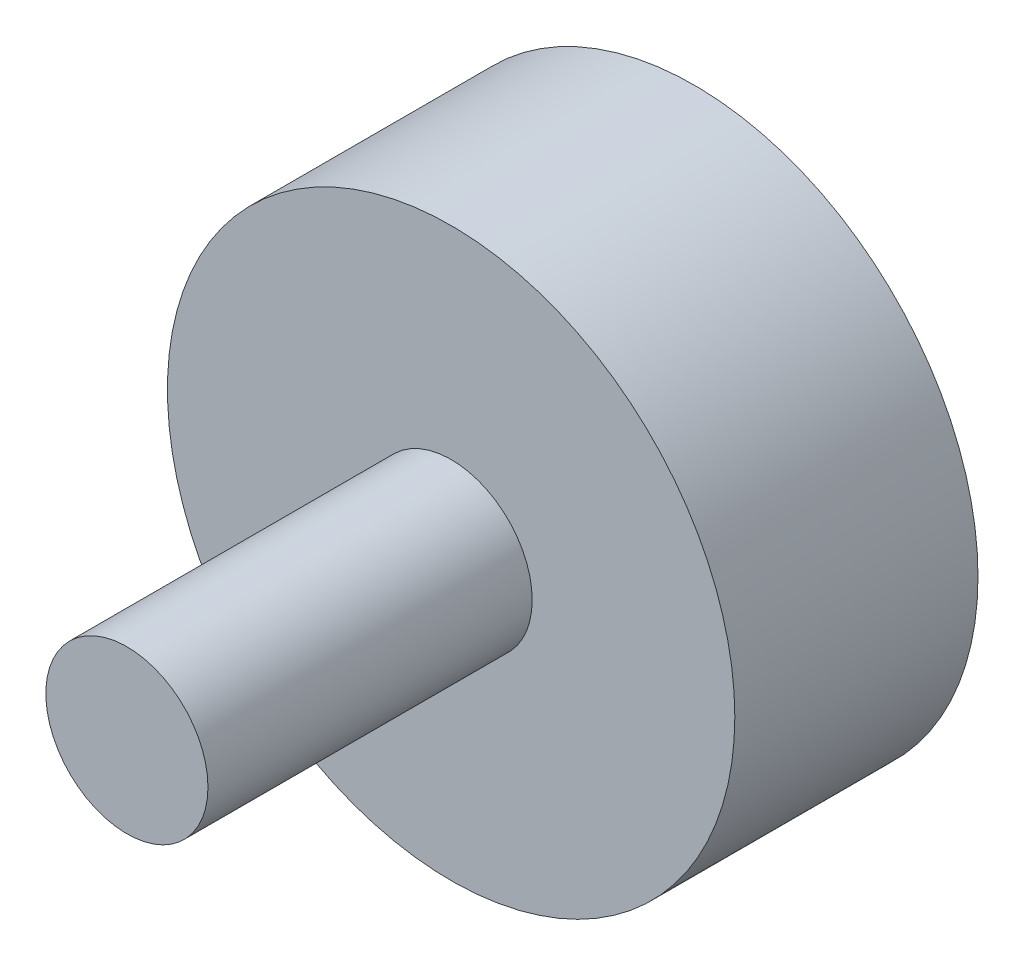
ISO-10303-21;
HEADER;
FILE_DESCRIPTION(('STEP AP214'),'2;1');
FILE_NAME('part.step','',(''),(''),'','','');
FILE_SCHEMA(('AUTOMOTIVE_DESIGN { 1 0 10303 214 1 1 1 1 }'));
ENDSEC;
DATA;
#1=APPLICATION_CONTEXT('core data for automotive mechanical design processes');
#2=APPLICATION_PROTOCOL_DEFINITION('international standard','automotive_design',2000,#1);
#3=PRODUCT_CONTEXT('',#1,'mechanical');
#4=PRODUCT('Part','Part','',(#3));
#5=PRODUCT_RELATED_PRODUCT_CATEGORY('part','',(#4));
#6=PRODUCT_DEFINITION_FORMATION('','',#4);
#7=PRODUCT_DEFINITION_CONTEXT('part definition',#1,'design');
#8=PRODUCT_DEFINITION('design','',#6,#7);
#9=PRODUCT_DEFINITION_SHAPE('','',#8);
#10=(LENGTH_UNIT() NAMED_UNIT(*) SI_UNIT(.MILLI.,.METRE.));
#11=(NAMED_UNIT(*) PLANE_ANGLE_UNIT() SI_UNIT($,.RADIAN.));
#12=(NAMED_UNIT(*) SI_UNIT($,.STERADIAN.) SOLID_ANGLE_UNIT());
#13=UNCERTAINTY_MEASURE_WITH_UNIT(LENGTH_MEASURE(1.E-05),#10,'distance_accuracy_value','');
#14=(GEOMETRIC_REPRESENTATION_CONTEXT(3) GLOBAL_UNCERTAINTY_ASSIGNED_CONTEXT((#13)) GLOBAL_UNIT_ASSIGNED_CONTEXT((#10,
#11,#12)) REPRESENTATION_CONTEXT('',''));
#15=CARTESIAN_POINT('',(0.,0.,0.));
#16=DIRECTION('',(0.,0.,1.));
#17=DIRECTION('',(1.,0.,0.));
#18=AXIS2_PLACEMENT_3D('',#15,#16,#17);
#19=CARTESIAN_POINT('',(0.,0.,3.));
#20=DIRECTION('',(0.,0.,-1.));
#21=DIRECTION('',(-1.,0.,0.));
#22=AXIS2_PLACEMENT_3D('',#19,#20,#21);
#23=CYLINDRICAL_SURFACE('',#22,3.5);
#24=CARTESIAN_POINT('',(0.,0.,3.));
#25=DIRECTION('',(0.,0.,1.));
#26=DIRECTION('',(1.,0.,0.));
#27=AXIS2_PLACEMENT_3D('',#24,#25,#26);
#28=CIRCLE('',#27,3.5);
#29=CARTESIAN_POINT('',(3.5,0.,3.));
#30=VERTEX_POINT('',#29);
#31=EDGE_CURVE('E45',#30,#30,#28,.T.);
#32=ORIENTED_EDGE('',*,*,#31,.F.);
#33=EDGE_LOOP('',(#32));
#34=FACE_BOUND('',#33,.T.);
#35=CARTESIAN_POINT('',(0.,0.,0.));
#36=DIRECTION('',(0.,0.,1.));
#37=DIRECTION('',(1.,0.,0.));
#38=AXIS2_PLACEMENT_3D('',#35,#36,#37);
#39=CIRCLE('',#38,3.5);
#40=CARTESIAN_POINT('',(3.5,0.,0.));
#41=VERTEX_POINT('',#40);
#42=EDGE_CURVE('E40',#41,#41,#39,.T.);
#43=ORIENTED_EDGE('',*,*,#42,.T.);
#44=EDGE_LOOP('',(#43));
#45=FACE_BOUND('',#44,.T.);
#46=ADVANCED_FACE('F37',(#34,#45),#23,.T.);
#47=CARTESIAN_POINT('',(0.,0.,3.));
#48=DIRECTION('',(0.,0.,1.));
#49=DIRECTION('',(1.,0.,0.));
#50=AXIS2_PLACEMENT_3D('',#47,#48,#49);
#51=PLANE('',#50);
#52=CARTESIAN_POINT('',(0.,0.,3.));
#53=DIRECTION('',(0.,0.,1.));
#54=DIRECTION('',(1.,0.,0.));
#55=AXIS2_PLACEMENT_3D('',#52,#53,#54);
#56=CIRCLE('',#55,1.);
#57=CARTESIAN_POINT('',(1.,0.,3.));
#58=VERTEX_POINT('',#57);
#59=EDGE_CURVE('E10',#58,#58,#56,.T.);
#60=ORIENTED_EDGE('',*,*,#59,.F.);
#61=EDGE_LOOP('',(#60));
#62=FACE_BOUND('',#61,.T.);
#63=ORIENTED_EDGE('',*,*,#31,.T.);
#64=EDGE_LOOP('',(#63));
#65=FACE_BOUND('',#64,.T.);
#66=ADVANCED_FACE('F65',(#62,#65),#51,.T.);
#67=CARTESIAN_POINT('',(0.,0.,0.));
#68=DIRECTION('',(0.,0.,1.));
#69=DIRECTION('',(1.,0.,0.));
#70=AXIS2_PLACEMENT_3D('',#67,#68,#69);
#71=PLANE('',#70);
#72=ORIENTED_EDGE('',*,*,#42,.F.);
#73=EDGE_LOOP('',(#72));
#74=FACE_BOUND('',#73,.T.);
#75=ADVANCED_FACE('F62',(#74),#71,.F.);
#76=CARTESIAN_POINT('',(0.,0.,7.));
#77=DIRECTION('',(0.,0.,-1.));
#78=DIRECTION('',(-1.,0.,0.));
#79=AXIS2_PLACEMENT_3D('',#76,#77,#78);
#80=CYLINDRICAL_SURFACE('',#79,1.);
#81=CARTESIAN_POINT('',(0.,0.,7.));
#82=DIRECTION('',(0.,0.,1.));
#83=DIRECTION('',(1.,0.,0.));
#84=AXIS2_PLACEMENT_3D('',#81,#82,#83);
#85=CIRCLE('',#84,1.);
#86=CARTESIAN_POINT('',(1.,0.,7.));
#87=VERTEX_POINT('',#86);
#88=EDGE_CURVE('E52',#87,#87,#85,.T.);
#89=ORIENTED_EDGE('',*,*,#88,.F.);
#90=EDGE_LOOP('',(#89));
#91=FACE_BOUND('',#90,.T.);
#92=ORIENTED_EDGE('',*,*,#59,.T.);
#93=EDGE_LOOP('',(#92));
#94=FACE_BOUND('',#93,.T.);
#95=ADVANCED_FACE('F64',(#91,#94),#80,.T.);
#96=CARTESIAN_POINT('',(0.,0.,7.));
#97=DIRECTION('',(0.,0.,1.));
#98=DIRECTION('',(1.,0.,0.));
#99=AXIS2_PLACEMENT_3D('',#96,#97,#98);
#100=PLANE('',#99);
#101=ORIENTED_EDGE('',*,*,#88,.T.);
#102=EDGE_LOOP('',(#101));
#103=FACE_BOUND('',#102,.T.);
#104=ADVANCED_FACE('F70',(#103),#100,.T.);
#105=CLOSED_SHELL('',(#46,#66,#75,#95,#104));
#106=MANIFOLD_SOLID_BREP('B2',#105);
#107=ADVANCED_BREP_SHAPE_REPRESENTATION('',(#18,#106),#14);
#108=SHAPE_DEFINITION_REPRESENTATION(#9,#107);
ENDSEC;
END-ISO-10303-21;
